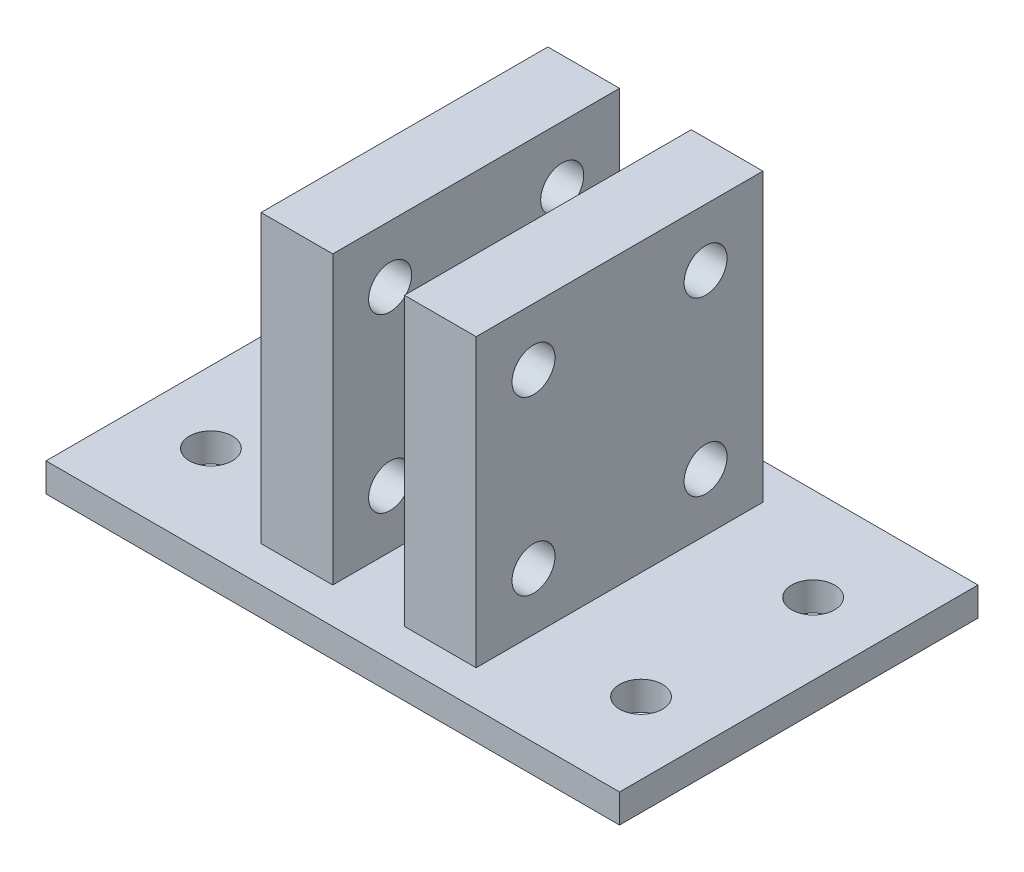
ISO-10303-21;
HEADER;
FILE_DESCRIPTION(('STEP AP214'),'2;1');
FILE_NAME('part.step','',(''),(''),'','','');
FILE_SCHEMA(('AUTOMOTIVE_DESIGN { 1 0 10303 214 1 1 1 1 }'));
ENDSEC;
DATA;
#1=APPLICATION_CONTEXT('core data for automotive mechanical design processes');
#2=APPLICATION_PROTOCOL_DEFINITION('international standard','automotive_design',2000,#1);
#3=PRODUCT_CONTEXT('',#1,'mechanical');
#4=PRODUCT('Part','Part','',(#3));
#5=PRODUCT_RELATED_PRODUCT_CATEGORY('part','',(#4));
#6=PRODUCT_DEFINITION_FORMATION('','',#4);
#7=PRODUCT_DEFINITION_CONTEXT('part definition',#1,'design');
#8=PRODUCT_DEFINITION('design','',#6,#7);
#9=PRODUCT_DEFINITION_SHAPE('','',#8);
#10=(LENGTH_UNIT() NAMED_UNIT(*) SI_UNIT(.MILLI.,.METRE.));
#11=(NAMED_UNIT(*) PLANE_ANGLE_UNIT() SI_UNIT($,.RADIAN.));
#12=(NAMED_UNIT(*) SI_UNIT($,.STERADIAN.) SOLID_ANGLE_UNIT());
#13=UNCERTAINTY_MEASURE_WITH_UNIT(LENGTH_MEASURE(1.E-05),#10,'distance_accuracy_value','');
#14=(GEOMETRIC_REPRESENTATION_CONTEXT(3) GLOBAL_UNCERTAINTY_ASSIGNED_CONTEXT((#13)) GLOBAL_UNIT_ASSIGNED_CONTEXT((#10,
#11,#12)) REPRESENTATION_CONTEXT('',''));
#15=CARTESIAN_POINT('',(0.,0.,0.));
#16=DIRECTION('',(0.,0.,1.));
#17=DIRECTION('',(1.,0.,0.));
#18=AXIS2_PLACEMENT_3D('',#15,#16,#17);
#19=CARTESIAN_POINT('',(-7.5,22.,-10.));
#20=DIRECTION('',(0.,0.,1.));
#21=DIRECTION('',(1.,0.,0.));
#22=AXIS2_PLACEMENT_3D('',#19,#20,#21);
#23=PLANE('',#22);
#24=DIRECTION('',(-1.,0.,0.));
#25=VECTOR('',#24,1.);
#26=CARTESIAN_POINT('',(-7.5,2.,-10.));
#27=LINE('',#26,#25);
#28=CARTESIAN_POINT('',(7.5,2.,-10.));
#29=VERTEX_POINT('',#28);
#30=CARTESIAN_POINT('',(2.5,2.,-10.));
#31=VERTEX_POINT('',#30);
#32=EDGE_CURVE('E143',#29,#31,#27,.T.);
#33=ORIENTED_EDGE('',*,*,#32,.T.);
#34=DIRECTION('',(0.,1.,0.));
#35=VECTOR('',#34,1.);
#36=CARTESIAN_POINT('',(2.5,2.,-10.));
#37=LINE('',#36,#35);
#38=CARTESIAN_POINT('',(2.5,22.,-10.));
#39=VERTEX_POINT('',#38);
#40=EDGE_CURVE('E129',#31,#39,#37,.T.);
#41=ORIENTED_EDGE('',*,*,#40,.T.);
#42=DIRECTION('',(-1.,0.,0.));
#43=VECTOR('',#42,1.);
#44=CARTESIAN_POINT('',(-7.5,22.,-10.));
#45=LINE('',#44,#43);
#46=CARTESIAN_POINT('',(7.5,22.,-10.));
#47=VERTEX_POINT('',#46);
#48=EDGE_CURVE('E278',#47,#39,#45,.T.);
#49=ORIENTED_EDGE('',*,*,#48,.F.);
#50=DIRECTION('',(0.,-1.,0.));
#51=VECTOR('',#50,1.);
#52=CARTESIAN_POINT('',(7.5,22.,-10.));
#53=LINE('',#52,#51);
#54=EDGE_CURVE('E148',#47,#29,#53,.T.);
#55=ORIENTED_EDGE('',*,*,#54,.T.);
#56=EDGE_LOOP('',(#33,#41,#49,#55));
#57=FACE_BOUND('',#56,.T.);
#58=ADVANCED_FACE('F37',(#57),#23,.F.);
#59=CARTESIAN_POINT('',(-7.5,22.,10.));
#60=DIRECTION('',(0.,0.,-1.));
#61=DIRECTION('',(-1.,0.,0.));
#62=AXIS2_PLACEMENT_3D('',#59,#60,#61);
#63=PLANE('',#62);
#64=DIRECTION('',(1.,0.,0.));
#65=VECTOR('',#64,1.);
#66=CARTESIAN_POINT('',(-7.5,22.,10.));
#67=LINE('',#66,#65);
#68=CARTESIAN_POINT('',(2.5,22.,10.));
#69=VERTEX_POINT('',#68);
#70=CARTESIAN_POINT('',(7.5,22.,10.));
#71=VERTEX_POINT('',#70);
#72=EDGE_CURVE('E281',#69,#71,#67,.T.);
#73=ORIENTED_EDGE('',*,*,#72,.F.);
#74=DIRECTION('',(0.,1.,0.));
#75=VECTOR('',#74,1.);
#76=CARTESIAN_POINT('',(2.5,2.,10.));
#77=LINE('',#76,#75);
#78=CARTESIAN_POINT('',(2.5,2.,10.));
#79=VERTEX_POINT('',#78);
#80=EDGE_CURVE('E269',#79,#69,#77,.T.);
#81=ORIENTED_EDGE('',*,*,#80,.F.);
#82=DIRECTION('',(1.,0.,0.));
#83=VECTOR('',#82,1.);
#84=CARTESIAN_POINT('',(-7.5,2.,10.));
#85=LINE('',#84,#83);
#86=CARTESIAN_POINT('',(7.5,2.,10.));
#87=VERTEX_POINT('',#86);
#88=EDGE_CURVE('E62',#79,#87,#85,.T.);
#89=ORIENTED_EDGE('',*,*,#88,.T.);
#90=DIRECTION('',(0.,-1.,0.));
#91=VECTOR('',#90,1.);
#92=CARTESIAN_POINT('',(7.5,22.,10.));
#93=LINE('',#92,#91);
#94=EDGE_CURVE('E163',#71,#87,#93,.T.);
#95=ORIENTED_EDGE('',*,*,#94,.F.);
#96=EDGE_LOOP('',(#73,#81,#89,#95));
#97=FACE_BOUND('',#96,.T.);
#98=ADVANCED_FACE('F289',(#97),#63,.F.);
#99=CARTESIAN_POINT('',(0.,22.,0.));
#100=DIRECTION('',(0.,1.,0.));
#101=DIRECTION('',(0.,0.,1.));
#102=AXIS2_PLACEMENT_3D('',#99,#100,#101);
#103=PLANE('',#102);
#104=DIRECTION('',(0.,0.,-1.));
#105=VECTOR('',#104,1.);
#106=CARTESIAN_POINT('',(2.5,22.,-10.));
#107=LINE('',#106,#105);
#108=EDGE_CURVE('E134',#69,#39,#107,.T.);
#109=ORIENTED_EDGE('',*,*,#108,.F.);
#110=ORIENTED_EDGE('',*,*,#72,.T.);
#111=DIRECTION('',(0.,0.,-1.));
#112=VECTOR('',#111,1.);
#113=CARTESIAN_POINT('',(7.5,22.,-10.));
#114=LINE('',#113,#112);
#115=EDGE_CURVE('E162',#71,#47,#114,.T.);
#116=ORIENTED_EDGE('',*,*,#115,.T.);
#117=ORIENTED_EDGE('',*,*,#48,.T.);
#118=EDGE_LOOP('',(#109,#110,#116,#117));
#119=FACE_BOUND('',#118,.T.);
#120=ADVANCED_FACE('F287',(#119),#103,.T.);
#121=CARTESIAN_POINT('',(20.,2.,-12.5));
#122=DIRECTION('',(-1.,0.,0.));
#123=DIRECTION('',(0.,0.,1.));
#124=AXIS2_PLACEMENT_3D('',#121,#122,#123);
#125=PLANE('',#124);
#126=DIRECTION('',(0.,0.,-1.));
#127=VECTOR('',#126,1.);
#128=CARTESIAN_POINT('',(20.,0.,-12.5));
#129=LINE('',#128,#127);
#130=CARTESIAN_POINT('',(20.,0.,12.5));
#131=VERTEX_POINT('',#130);
#132=CARTESIAN_POINT('',(20.,0.,-12.5));
#133=VERTEX_POINT('',#132);
#134=EDGE_CURVE('E174',#131,#133,#129,.T.);
#135=ORIENTED_EDGE('',*,*,#134,.T.);
#136=DIRECTION('',(0.,-1.,0.));
#137=VECTOR('',#136,1.);
#138=CARTESIAN_POINT('',(20.,2.,-12.5));
#139=LINE('',#138,#137);
#140=CARTESIAN_POINT('',(20.,2.,-12.5));
#141=VERTEX_POINT('',#140);
#142=EDGE_CURVE('E11',#141,#133,#139,.T.);
#143=ORIENTED_EDGE('',*,*,#142,.F.);
#144=DIRECTION('',(0.,0.,-1.));
#145=VECTOR('',#144,1.);
#146=CARTESIAN_POINT('',(20.,2.,-12.5));
#147=LINE('',#146,#145);
#148=CARTESIAN_POINT('',(20.,2.,12.5));
#149=VERTEX_POINT('',#148);
#150=EDGE_CURVE('E175',#149,#141,#147,.T.);
#151=ORIENTED_EDGE('',*,*,#150,.F.);
#152=DIRECTION('',(0.,-1.,0.));
#153=VECTOR('',#152,1.);
#154=CARTESIAN_POINT('',(20.,2.,12.5));
#155=LINE('',#154,#153);
#156=EDGE_CURVE('E185',#149,#131,#155,.T.);
#157=ORIENTED_EDGE('',*,*,#156,.T.);
#158=EDGE_LOOP('',(#135,#143,#151,#157));
#159=FACE_BOUND('',#158,.T.);
#160=ADVANCED_FACE('F39',(#159),#125,.F.);
#161=CARTESIAN_POINT('',(-20.,2.,-12.5));
#162=DIRECTION('',(0.,0.,1.));
#163=DIRECTION('',(1.,0.,0.));
#164=AXIS2_PLACEMENT_3D('',#161,#162,#163);
#165=PLANE('',#164);
#166=DIRECTION('',(-1.,0.,0.));
#167=VECTOR('',#166,1.);
#168=CARTESIAN_POINT('',(-20.,0.,-12.5));
#169=LINE('',#168,#167);
#170=CARTESIAN_POINT('',(-20.,0.,-12.5));
#171=VERTEX_POINT('',#170);
#172=EDGE_CURVE('E188',#133,#171,#169,.T.);
#173=ORIENTED_EDGE('',*,*,#172,.T.);
#174=DIRECTION('',(0.,-1.,0.));
#175=VECTOR('',#174,1.);
#176=CARTESIAN_POINT('',(-20.,2.,-12.5));
#177=LINE('',#176,#175);
#178=CARTESIAN_POINT('',(-20.,2.,-12.5));
#179=VERTEX_POINT('',#178);
#180=EDGE_CURVE('E46',#179,#171,#177,.T.);
#181=ORIENTED_EDGE('',*,*,#180,.F.);
#182=DIRECTION('',(-1.,0.,0.));
#183=VECTOR('',#182,1.);
#184=CARTESIAN_POINT('',(-20.,2.,-12.5));
#185=LINE('',#184,#183);
#186=EDGE_CURVE('E178',#141,#179,#185,.T.);
#187=ORIENTED_EDGE('',*,*,#186,.F.);
#188=ORIENTED_EDGE('',*,*,#142,.T.);
#189=EDGE_LOOP('',(#173,#181,#187,#188));
#190=FACE_BOUND('',#189,.T.);
#191=ADVANCED_FACE('F391',(#190),#165,.F.);
#192=CARTESIAN_POINT('',(-20.,2.,-12.5));
#193=DIRECTION('',(1.,0.,0.));
#194=DIRECTION('',(0.,0.,-1.));
#195=AXIS2_PLACEMENT_3D('',#192,#193,#194);
#196=PLANE('',#195);
#197=DIRECTION('',(0.,0.,1.));
#198=VECTOR('',#197,1.);
#199=CARTESIAN_POINT('',(-20.,0.,-12.5));
#200=LINE('',#199,#198);
#201=CARTESIAN_POINT('',(-20.,0.,12.5));
#202=VERTEX_POINT('',#201);
#203=EDGE_CURVE('E190',#171,#202,#200,.T.);
#204=ORIENTED_EDGE('',*,*,#203,.T.);
#205=DIRECTION('',(0.,-1.,0.));
#206=VECTOR('',#205,1.);
#207=CARTESIAN_POINT('',(-20.,2.,12.5));
#208=LINE('',#207,#206);
#209=CARTESIAN_POINT('',(-20.,2.,12.5));
#210=VERTEX_POINT('',#209);
#211=EDGE_CURVE('E195',#210,#202,#208,.T.);
#212=ORIENTED_EDGE('',*,*,#211,.F.);
#213=DIRECTION('',(0.,0.,1.));
#214=VECTOR('',#213,1.);
#215=CARTESIAN_POINT('',(-20.,2.,-12.5));
#216=LINE('',#215,#214);
#217=EDGE_CURVE('E181',#179,#210,#216,.T.);
#218=ORIENTED_EDGE('',*,*,#217,.F.);
#219=ORIENTED_EDGE('',*,*,#180,.T.);
#220=EDGE_LOOP('',(#204,#212,#218,#219));
#221=FACE_BOUND('',#220,.T.);
#222=ADVANCED_FACE('F388',(#221),#196,.F.);
#223=CARTESIAN_POINT('',(-20.,2.,12.5));
#224=DIRECTION('',(0.,0.,-1.));
#225=DIRECTION('',(-1.,0.,0.));
#226=AXIS2_PLACEMENT_3D('',#223,#224,#225);
#227=PLANE('',#226);
#228=DIRECTION('',(1.,0.,0.));
#229=VECTOR('',#228,1.);
#230=CARTESIAN_POINT('',(-20.,0.,12.5));
#231=LINE('',#230,#229);
#232=EDGE_CURVE('E179',#202,#131,#231,.T.);
#233=ORIENTED_EDGE('',*,*,#232,.T.);
#234=ORIENTED_EDGE('',*,*,#156,.F.);
#235=DIRECTION('',(1.,0.,0.));
#236=VECTOR('',#235,1.);
#237=CARTESIAN_POINT('',(-20.,2.,12.5));
#238=LINE('',#237,#236);
#239=EDGE_CURVE('E183',#210,#149,#238,.T.);
#240=ORIENTED_EDGE('',*,*,#239,.F.);
#241=ORIENTED_EDGE('',*,*,#211,.T.);
#242=EDGE_LOOP('',(#233,#234,#240,#241));
#243=FACE_BOUND('',#242,.T.);
#244=ADVANCED_FACE('F384',(#243),#227,.F.);
#245=CARTESIAN_POINT('',(0.,2.,0.));
#246=DIRECTION('',(0.,1.,0.));
#247=DIRECTION('',(0.,0.,1.));
#248=AXIS2_PLACEMENT_3D('',#245,#246,#247);
#249=PLANE('',#248);
#250=CARTESIAN_POINT('',(-15.,2.,6.));
#251=DIRECTION('',(0.,1.,0.));
#252=DIRECTION('',(0.,0.,1.));
#253=AXIS2_PLACEMENT_3D('',#250,#251,#252);
#254=CIRCLE('',#253,1.5);
#255=CARTESIAN_POINT('',(-15.,2.,7.5));
#256=VERTEX_POINT('',#255);
#257=EDGE_CURVE('E603',#256,#256,#254,.T.);
#258=ORIENTED_EDGE('',*,*,#257,.F.);
#259=EDGE_LOOP('',(#258));
#260=FACE_BOUND('',#259,.T.);
#261=CARTESIAN_POINT('',(15.,2.,-6.));
#262=DIRECTION('',(0.,1.,0.));
#263=DIRECTION('',(0.,0.,1.));
#264=AXIS2_PLACEMENT_3D('',#261,#262,#263);
#265=CIRCLE('',#264,1.5);
#266=CARTESIAN_POINT('',(15.,2.,-4.5));
#267=VERTEX_POINT('',#266);
#268=EDGE_CURVE('E607',#267,#267,#265,.T.);
#269=ORIENTED_EDGE('',*,*,#268,.F.);
#270=EDGE_LOOP('',(#269));
#271=FACE_BOUND('',#270,.T.);
#272=CARTESIAN_POINT('',(15.,2.,6.));
#273=DIRECTION('',(0.,1.,0.));
#274=DIRECTION('',(0.,0.,1.));
#275=AXIS2_PLACEMENT_3D('',#272,#273,#274);
#276=CIRCLE('',#275,1.5);
#277=CARTESIAN_POINT('',(15.,2.,7.5));
#278=VERTEX_POINT('',#277);
#279=EDGE_CURVE('E369',#278,#278,#276,.T.);
#280=ORIENTED_EDGE('',*,*,#279,.F.);
#281=EDGE_LOOP('',(#280));
#282=FACE_BOUND('',#281,.T.);
#283=CARTESIAN_POINT('',(-15.,2.,-6.));
#284=DIRECTION('',(0.,1.,0.));
#285=DIRECTION('',(0.,0.,1.));
#286=AXIS2_PLACEMENT_3D('',#283,#284,#285);
#287=CIRCLE('',#286,1.5);
#288=CARTESIAN_POINT('',(-15.,2.,-4.5));
#289=VERTEX_POINT('',#288);
#290=EDGE_CURVE('E221',#289,#289,#287,.T.);
#291=ORIENTED_EDGE('',*,*,#290,.F.);
#292=EDGE_LOOP('',(#291));
#293=FACE_BOUND('',#292,.T.);
#294=CARTESIAN_POINT('',(-2.5,2.,-10.));
#295=VERTEX_POINT('',#294);
#296=CARTESIAN_POINT('',(-7.5,2.,-10.));
#297=VERTEX_POINT('',#296);
#298=EDGE_CURVE('E151',#295,#297,#27,.T.);
#299=ORIENTED_EDGE('',*,*,#298,.F.);
#300=DIRECTION('',(0.,0.,1.));
#301=VECTOR('',#300,1.);
#302=CARTESIAN_POINT('',(-2.5,2.,-10.));
#303=LINE('',#302,#301);
#304=CARTESIAN_POINT('',(-2.5,2.,10.));
#305=VERTEX_POINT('',#304);
#306=EDGE_CURVE('E138',#295,#305,#303,.T.);
#307=ORIENTED_EDGE('',*,*,#306,.T.);
#308=CARTESIAN_POINT('',(-7.5,2.,10.));
#309=VERTEX_POINT('',#308);
#310=EDGE_CURVE('E159',#309,#305,#85,.T.);
#311=ORIENTED_EDGE('',*,*,#310,.F.);
#312=DIRECTION('',(0.,0.,1.));
#313=VECTOR('',#312,1.);
#314=CARTESIAN_POINT('',(-7.5,2.,-10.));
#315=LINE('',#314,#313);
#316=EDGE_CURVE('E150',#297,#309,#315,.T.);
#317=ORIENTED_EDGE('',*,*,#316,.F.);
#318=EDGE_LOOP('',(#299,#307,#311,#317));
#319=FACE_BOUND('',#318,.T.);
#320=DIRECTION('',(0.,0.,-1.));
#321=VECTOR('',#320,1.);
#322=CARTESIAN_POINT('',(7.5,2.,-10.));
#323=LINE('',#322,#321);
#324=EDGE_CURVE('E155',#87,#29,#323,.T.);
#325=ORIENTED_EDGE('',*,*,#324,.F.);
#326=ORIENTED_EDGE('',*,*,#88,.F.);
#327=DIRECTION('',(0.,0.,-1.));
#328=VECTOR('',#327,1.);
#329=CARTESIAN_POINT('',(2.5,2.,-10.));
#330=LINE('',#329,#328);
#331=EDGE_CURVE('E132',#79,#31,#330,.T.);
#332=ORIENTED_EDGE('',*,*,#331,.T.);
#333=ORIENTED_EDGE('',*,*,#32,.F.);
#334=EDGE_LOOP('',(#325,#326,#332,#333));
#335=FACE_BOUND('',#334,.T.);
#336=ORIENTED_EDGE('',*,*,#150,.T.);
#337=ORIENTED_EDGE('',*,*,#186,.T.);
#338=ORIENTED_EDGE('',*,*,#217,.T.);
#339=ORIENTED_EDGE('',*,*,#239,.T.);
#340=EDGE_LOOP('',(#336,#337,#338,#339));
#341=FACE_BOUND('',#340,.T.);
#342=ADVANCED_FACE('F141',(#260,#271,#282,#293,#319,#335,#341),#249,.T.);
#343=CARTESIAN_POINT('',(0.,0.,0.));
#344=DIRECTION('',(0.,1.,0.));
#345=DIRECTION('',(0.,0.,1.));
#346=AXIS2_PLACEMENT_3D('',#343,#344,#345);
#347=PLANE('',#346);
#348=CARTESIAN_POINT('',(-15.,0.,6.));
#349=DIRECTION('',(0.,1.,0.));
#350=DIRECTION('',(0.,0.,1.));
#351=AXIS2_PLACEMENT_3D('',#348,#349,#350);
#352=CIRCLE('',#351,1.5);
#353=CARTESIAN_POINT('',(-15.,0.,7.5));
#354=VERTEX_POINT('',#353);
#355=EDGE_CURVE('E41',#354,#354,#352,.T.);
#356=ORIENTED_EDGE('',*,*,#355,.T.);
#357=EDGE_LOOP('',(#356));
#358=FACE_BOUND('',#357,.T.);
#359=CARTESIAN_POINT('',(15.,0.,-6.));
#360=DIRECTION('',(0.,1.,0.));
#361=DIRECTION('',(0.,0.,1.));
#362=AXIS2_PLACEMENT_3D('',#359,#360,#361);
#363=CIRCLE('',#362,1.5);
#364=CARTESIAN_POINT('',(15.,0.,-4.5));
#365=VERTEX_POINT('',#364);
#366=EDGE_CURVE('E223',#365,#365,#363,.T.);
#367=ORIENTED_EDGE('',*,*,#366,.T.);
#368=EDGE_LOOP('',(#367));
#369=FACE_BOUND('',#368,.T.);
#370=CARTESIAN_POINT('',(15.,0.,6.));
#371=DIRECTION('',(0.,1.,0.));
#372=DIRECTION('',(0.,0.,1.));
#373=AXIS2_PLACEMENT_3D('',#370,#371,#372);
#374=CIRCLE('',#373,1.5);
#375=CARTESIAN_POINT('',(15.,0.,7.5));
#376=VERTEX_POINT('',#375);
#377=EDGE_CURVE('E220',#376,#376,#374,.T.);
#378=ORIENTED_EDGE('',*,*,#377,.T.);
#379=EDGE_LOOP('',(#378));
#380=FACE_BOUND('',#379,.T.);
#381=CARTESIAN_POINT('',(-15.,0.,-6.));
#382=DIRECTION('',(0.,1.,0.));
#383=DIRECTION('',(0.,0.,1.));
#384=AXIS2_PLACEMENT_3D('',#381,#382,#383);
#385=CIRCLE('',#384,1.5);
#386=CARTESIAN_POINT('',(-15.,0.,-4.5));
#387=VERTEX_POINT('',#386);
#388=EDGE_CURVE('E217',#387,#387,#385,.T.);
#389=ORIENTED_EDGE('',*,*,#388,.T.);
#390=EDGE_LOOP('',(#389));
#391=FACE_BOUND('',#390,.T.);
#392=ORIENTED_EDGE('',*,*,#134,.F.);
#393=ORIENTED_EDGE('',*,*,#232,.F.);
#394=ORIENTED_EDGE('',*,*,#203,.F.);
#395=ORIENTED_EDGE('',*,*,#172,.F.);
#396=EDGE_LOOP('',(#392,#393,#394,#395));
#397=FACE_BOUND('',#396,.T.);
#398=ADVANCED_FACE('F294',(#358,#369,#380,#391,#397),#347,.F.);
#399=CARTESIAN_POINT('',(7.5,22.,-10.));
#400=DIRECTION('',(-1.,0.,0.));
#401=DIRECTION('',(0.,0.,1.));
#402=AXIS2_PLACEMENT_3D('',#399,#400,#401);
#403=PLANE('',#402);
#404=CARTESIAN_POINT('',(7.5,18.,-6.));
#405=DIRECTION('',(1.,0.,0.));
#406=DIRECTION('',(0.,0.,-1.));
#407=AXIS2_PLACEMENT_3D('',#404,#405,#406);
#408=CIRCLE('',#407,1.5);
#409=CARTESIAN_POINT('',(7.5,18.,-7.5));
#410=VERTEX_POINT('',#409);
#411=EDGE_CURVE('E245',#410,#410,#408,.T.);
#412=ORIENTED_EDGE('',*,*,#411,.F.);
#413=EDGE_LOOP('',(#412));
#414=FACE_BOUND('',#413,.T.);
#415=CARTESIAN_POINT('',(7.5,5.99999999999999,6.));
#416=DIRECTION('',(1.,0.,0.));
#417=DIRECTION('',(0.,0.,-1.));
#418=AXIS2_PLACEMENT_3D('',#415,#416,#417);
#419=CIRCLE('',#418,1.5);
#420=CARTESIAN_POINT('',(7.5,5.99999999999999,4.5));
#421=VERTEX_POINT('',#420);
#422=EDGE_CURVE('E237',#421,#421,#419,.T.);
#423=ORIENTED_EDGE('',*,*,#422,.F.);
#424=EDGE_LOOP('',(#423));
#425=FACE_BOUND('',#424,.T.);
#426=CARTESIAN_POINT('',(7.5,5.99999999999999,-6.));
#427=DIRECTION('',(1.,0.,0.));
#428=DIRECTION('',(0.,0.,-1.));
#429=AXIS2_PLACEMENT_3D('',#426,#427,#428);
#430=CIRCLE('',#429,1.5);
#431=CARTESIAN_POINT('',(7.5,5.99999999999999,-7.5));
#432=VERTEX_POINT('',#431);
#433=EDGE_CURVE('E228',#432,#432,#430,.T.);
#434=ORIENTED_EDGE('',*,*,#433,.F.);
#435=EDGE_LOOP('',(#434));
#436=FACE_BOUND('',#435,.T.);
#437=CARTESIAN_POINT('',(7.5,18.,6.00000000000001));
#438=DIRECTION('',(1.,0.,0.));
#439=DIRECTION('',(0.,0.,-1.));
#440=AXIS2_PLACEMENT_3D('',#437,#438,#439);
#441=CIRCLE('',#440,1.5);
#442=CARTESIAN_POINT('',(7.5,18.,4.5));
#443=VERTEX_POINT('',#442);
#444=EDGE_CURVE('E244',#443,#443,#441,.T.);
#445=ORIENTED_EDGE('',*,*,#444,.F.);
#446=EDGE_LOOP('',(#445));
#447=FACE_BOUND('',#446,.T.);
#448=ORIENTED_EDGE('',*,*,#324,.T.);
#449=ORIENTED_EDGE('',*,*,#54,.F.);
#450=ORIENTED_EDGE('',*,*,#115,.F.);
#451=ORIENTED_EDGE('',*,*,#94,.T.);
#452=EDGE_LOOP('',(#448,#449,#450,#451));
#453=FACE_BOUND('',#452,.T.);
#454=ADVANCED_FACE('F291',(#414,#425,#436,#447,#453),#403,.F.);
#455=CARTESIAN_POINT('',(-2.5,22.,-10.));
#456=VERTEX_POINT('',#455);
#457=CARTESIAN_POINT('',(-7.5,22.,-10.));
#458=VERTEX_POINT('',#457);
#459=EDGE_CURVE('E277',#456,#458,#45,.T.);
#460=ORIENTED_EDGE('',*,*,#459,.F.);
#461=DIRECTION('',(0.,1.,0.));
#462=VECTOR('',#461,1.);
#463=CARTESIAN_POINT('',(-2.5,2.,-10.));
#464=LINE('',#463,#462);
#465=EDGE_CURVE('E54',#295,#456,#464,.T.);
#466=ORIENTED_EDGE('',*,*,#465,.F.);
#467=ORIENTED_EDGE('',*,*,#298,.T.);
#468=DIRECTION('',(0.,-1.,0.));
#469=VECTOR('',#468,1.);
#470=CARTESIAN_POINT('',(-7.5,22.,-10.));
#471=LINE('',#470,#469);
#472=EDGE_CURVE('E170',#458,#297,#471,.T.);
#473=ORIENTED_EDGE('',*,*,#472,.F.);
#474=EDGE_LOOP('',(#460,#466,#467,#473));
#475=FACE_BOUND('',#474,.T.);
#476=ADVANCED_FACE('F293',(#475),#23,.F.);
#477=CARTESIAN_POINT('',(-7.5,22.,-10.));
#478=DIRECTION('',(1.,0.,0.));
#479=DIRECTION('',(0.,0.,-1.));
#480=AXIS2_PLACEMENT_3D('',#477,#478,#479);
#481=PLANE('',#480);
#482=CARTESIAN_POINT('',(-7.5,18.,-6.));
#483=DIRECTION('',(1.,0.,0.));
#484=DIRECTION('',(0.,0.,-1.));
#485=AXIS2_PLACEMENT_3D('',#482,#483,#484);
#486=CIRCLE('',#485,1.5);
#487=CARTESIAN_POINT('',(-7.5,18.,-7.5));
#488=VERTEX_POINT('',#487);
#489=EDGE_CURVE('E241',#488,#488,#486,.T.);
#490=ORIENTED_EDGE('',*,*,#489,.T.);
#491=EDGE_LOOP('',(#490));
#492=FACE_BOUND('',#491,.T.);
#493=CARTESIAN_POINT('',(-7.5,5.99999999999999,6.00000000000001));
#494=DIRECTION('',(1.,0.,0.));
#495=DIRECTION('',(0.,0.,-1.));
#496=AXIS2_PLACEMENT_3D('',#493,#494,#495);
#497=CIRCLE('',#496,1.5);
#498=CARTESIAN_POINT('',(-7.5,5.99999999999999,4.50000000000001));
#499=VERTEX_POINT('',#498);
#500=EDGE_CURVE('E248',#499,#499,#497,.T.);
#501=ORIENTED_EDGE('',*,*,#500,.T.);
#502=EDGE_LOOP('',(#501));
#503=FACE_BOUND('',#502,.T.);
#504=CARTESIAN_POINT('',(-7.5,5.99999999999999,-6.));
#505=DIRECTION('',(1.,0.,0.));
#506=DIRECTION('',(0.,0.,-1.));
#507=AXIS2_PLACEMENT_3D('',#504,#505,#506);
#508=CIRCLE('',#507,1.5);
#509=CARTESIAN_POINT('',(-7.5,5.99999999999999,-7.5));
#510=VERTEX_POINT('',#509);
#511=EDGE_CURVE('E232',#510,#510,#508,.T.);
#512=ORIENTED_EDGE('',*,*,#511,.T.);
#513=EDGE_LOOP('',(#512));
#514=FACE_BOUND('',#513,.T.);
#515=CARTESIAN_POINT('',(-7.5,18.,6.00000000000001));
#516=DIRECTION('',(1.,0.,0.));
#517=DIRECTION('',(0.,0.,-1.));
#518=AXIS2_PLACEMENT_3D('',#515,#516,#517);
#519=CIRCLE('',#518,1.5);
#520=CARTESIAN_POINT('',(-7.5,18.,4.50000000000001));
#521=VERTEX_POINT('',#520);
#522=EDGE_CURVE('E204',#521,#521,#519,.T.);
#523=ORIENTED_EDGE('',*,*,#522,.T.);
#524=EDGE_LOOP('',(#523));
#525=FACE_BOUND('',#524,.T.);
#526=ORIENTED_EDGE('',*,*,#316,.T.);
#527=DIRECTION('',(0.,-1.,0.));
#528=VECTOR('',#527,1.);
#529=CARTESIAN_POINT('',(-7.5,22.,10.));
#530=LINE('',#529,#528);
#531=CARTESIAN_POINT('',(-7.5,22.,10.));
#532=VERTEX_POINT('',#531);
#533=EDGE_CURVE('E166',#532,#309,#530,.T.);
#534=ORIENTED_EDGE('',*,*,#533,.F.);
#535=DIRECTION('',(0.,0.,1.));
#536=VECTOR('',#535,1.);
#537=CARTESIAN_POINT('',(-7.5,22.,-10.));
#538=LINE('',#537,#536);
#539=EDGE_CURVE('E280',#458,#532,#538,.T.);
#540=ORIENTED_EDGE('',*,*,#539,.F.);
#541=ORIENTED_EDGE('',*,*,#472,.T.);
#542=EDGE_LOOP('',(#526,#534,#540,#541));
#543=FACE_BOUND('',#542,.T.);
#544=ADVANCED_FACE('F301',(#492,#503,#514,#525,#543),#481,.F.);
#545=ORIENTED_EDGE('',*,*,#310,.T.);
#546=DIRECTION('',(0.,1.,0.));
#547=VECTOR('',#546,1.);
#548=CARTESIAN_POINT('',(-2.5,2.,10.));
#549=LINE('',#548,#547);
#550=CARTESIAN_POINT('',(-2.5,22.,10.));
#551=VERTEX_POINT('',#550);
#552=EDGE_CURVE('E271',#305,#551,#549,.T.);
#553=ORIENTED_EDGE('',*,*,#552,.T.);
#554=EDGE_CURVE('E167',#532,#551,#67,.T.);
#555=ORIENTED_EDGE('',*,*,#554,.F.);
#556=ORIENTED_EDGE('',*,*,#533,.T.);
#557=EDGE_LOOP('',(#545,#553,#555,#556));
#558=FACE_BOUND('',#557,.T.);
#559=ADVANCED_FACE('F313',(#558),#63,.F.);
#560=DIRECTION('',(0.,0.,1.));
#561=VECTOR('',#560,1.);
#562=CARTESIAN_POINT('',(-2.5,22.,-10.));
#563=LINE('',#562,#561);
#564=EDGE_CURVE('E145',#456,#551,#563,.T.);
#565=ORIENTED_EDGE('',*,*,#564,.F.);
#566=ORIENTED_EDGE('',*,*,#459,.T.);
#567=ORIENTED_EDGE('',*,*,#539,.T.);
#568=ORIENTED_EDGE('',*,*,#554,.T.);
#569=EDGE_LOOP('',(#565,#566,#567,#568));
#570=FACE_BOUND('',#569,.T.);
#571=ADVANCED_FACE('F319',(#570),#103,.T.);
#572=CARTESIAN_POINT('',(2.5,2.,-10.));
#573=DIRECTION('',(1.,0.,0.));
#574=DIRECTION('',(0.,0.,-1.));
#575=AXIS2_PLACEMENT_3D('',#572,#573,#574);
#576=PLANE('',#575);
#577=CARTESIAN_POINT('',(2.5,18.,-6.));
#578=DIRECTION('',(1.,0.,0.));
#579=DIRECTION('',(0.,0.,-1.));
#580=AXIS2_PLACEMENT_3D('',#577,#578,#579);
#581=CIRCLE('',#580,1.5);
#582=CARTESIAN_POINT('',(2.5,18.,-7.5));
#583=VERTEX_POINT('',#582);
#584=EDGE_CURVE('E216',#583,#583,#581,.T.);
#585=ORIENTED_EDGE('',*,*,#584,.T.);
#586=EDGE_LOOP('',(#585));
#587=FACE_BOUND('',#586,.T.);
#588=CARTESIAN_POINT('',(2.5,5.99999999999999,6.));
#589=DIRECTION('',(1.,0.,0.));
#590=DIRECTION('',(0.,0.,-1.));
#591=AXIS2_PLACEMENT_3D('',#588,#589,#590);
#592=CIRCLE('',#591,1.5);
#593=CARTESIAN_POINT('',(2.5,5.99999999999999,4.5));
#594=VERTEX_POINT('',#593);
#595=EDGE_CURVE('E212',#594,#594,#592,.T.);
#596=ORIENTED_EDGE('',*,*,#595,.T.);
#597=EDGE_LOOP('',(#596));
#598=FACE_BOUND('',#597,.T.);
#599=CARTESIAN_POINT('',(2.5,5.99999999999999,-6.));
#600=DIRECTION('',(1.,0.,0.));
#601=DIRECTION('',(0.,0.,-1.));
#602=AXIS2_PLACEMENT_3D('',#599,#600,#601);
#603=CIRCLE('',#602,1.5);
#604=CARTESIAN_POINT('',(2.5,5.99999999999999,-7.5));
#605=VERTEX_POINT('',#604);
#606=EDGE_CURVE('E208',#605,#605,#603,.T.);
#607=ORIENTED_EDGE('',*,*,#606,.T.);
#608=EDGE_LOOP('',(#607));
#609=FACE_BOUND('',#608,.T.);
#610=CARTESIAN_POINT('',(2.5,18.,6.00000000000001));
#611=DIRECTION('',(1.,0.,0.));
#612=DIRECTION('',(0.,0.,-1.));
#613=AXIS2_PLACEMENT_3D('',#610,#611,#612);
#614=CIRCLE('',#613,1.5);
#615=CARTESIAN_POINT('',(2.5,18.,4.5));
#616=VERTEX_POINT('',#615);
#617=EDGE_CURVE('E203',#616,#616,#614,.T.);
#618=ORIENTED_EDGE('',*,*,#617,.T.);
#619=EDGE_LOOP('',(#618));
#620=FACE_BOUND('',#619,.T.);
#621=ORIENTED_EDGE('',*,*,#108,.T.);
#622=ORIENTED_EDGE('',*,*,#40,.F.);
#623=ORIENTED_EDGE('',*,*,#331,.F.);
#624=ORIENTED_EDGE('',*,*,#80,.T.);
#625=EDGE_LOOP('',(#621,#622,#623,#624));
#626=FACE_BOUND('',#625,.T.);
#627=ADVANCED_FACE('F131',(#587,#598,#609,#620,#626),#576,.F.);
#628=CARTESIAN_POINT('',(-2.5,2.,-10.));
#629=DIRECTION('',(-1.,0.,0.));
#630=DIRECTION('',(0.,0.,1.));
#631=AXIS2_PLACEMENT_3D('',#628,#629,#630);
#632=PLANE('',#631);
#633=CARTESIAN_POINT('',(-2.5,18.,-6.));
#634=DIRECTION('',(-1.,0.,0.));
#635=DIRECTION('',(0.,0.,1.));
#636=AXIS2_PLACEMENT_3D('',#633,#634,#635);
#637=CIRCLE('',#636,1.5);
#638=CARTESIAN_POINT('',(-2.5,18.,-4.5));
#639=VERTEX_POINT('',#638);
#640=EDGE_CURVE('E213',#639,#639,#637,.T.);
#641=ORIENTED_EDGE('',*,*,#640,.T.);
#642=EDGE_LOOP('',(#641));
#643=FACE_BOUND('',#642,.T.);
#644=CARTESIAN_POINT('',(-2.5,5.99999999999999,6.));
#645=DIRECTION('',(-1.,0.,0.));
#646=DIRECTION('',(0.,0.,1.));
#647=AXIS2_PLACEMENT_3D('',#644,#645,#646);
#648=CIRCLE('',#647,1.5);
#649=CARTESIAN_POINT('',(-2.5,5.99999999999999,7.5));
#650=VERTEX_POINT('',#649);
#651=EDGE_CURVE('E209',#650,#650,#648,.T.);
#652=ORIENTED_EDGE('',*,*,#651,.T.);
#653=EDGE_LOOP('',(#652));
#654=FACE_BOUND('',#653,.T.);
#655=CARTESIAN_POINT('',(-2.5,5.99999999999999,-6.));
#656=DIRECTION('',(-1.,0.,0.));
#657=DIRECTION('',(0.,0.,1.));
#658=AXIS2_PLACEMENT_3D('',#655,#656,#657);
#659=CIRCLE('',#658,1.5);
#660=CARTESIAN_POINT('',(-2.5,5.99999999999999,-4.5));
#661=VERTEX_POINT('',#660);
#662=EDGE_CURVE('E205',#661,#661,#659,.T.);
#663=ORIENTED_EDGE('',*,*,#662,.T.);
#664=EDGE_LOOP('',(#663));
#665=FACE_BOUND('',#664,.T.);
#666=CARTESIAN_POINT('',(-2.5,18.,6.00000000000001));
#667=DIRECTION('',(-1.,0.,0.));
#668=DIRECTION('',(0.,0.,1.));
#669=AXIS2_PLACEMENT_3D('',#666,#667,#668);
#670=CIRCLE('',#669,1.5);
#671=CARTESIAN_POINT('',(-2.5,18.,7.50000000000001));
#672=VERTEX_POINT('',#671);
#673=EDGE_CURVE('E200',#672,#672,#670,.T.);
#674=ORIENTED_EDGE('',*,*,#673,.T.);
#675=EDGE_LOOP('',(#674));
#676=FACE_BOUND('',#675,.T.);
#677=ORIENTED_EDGE('',*,*,#564,.T.);
#678=ORIENTED_EDGE('',*,*,#552,.F.);
#679=ORIENTED_EDGE('',*,*,#306,.F.);
#680=ORIENTED_EDGE('',*,*,#465,.T.);
#681=EDGE_LOOP('',(#677,#678,#679,#680));
#682=FACE_BOUND('',#681,.T.);
#683=ADVANCED_FACE('F325',(#643,#654,#665,#676,#682),#632,.F.);
#684=CARTESIAN_POINT('',(-7.5,18.,6.00000000000001));
#685=DIRECTION('',(1.,0.,0.));
#686=DIRECTION('',(0.,0.,-1.));
#687=AXIS2_PLACEMENT_3D('',#684,#685,#686);
#688=CYLINDRICAL_SURFACE('',#687,1.5);
#689=ORIENTED_EDGE('',*,*,#522,.F.);
#690=EDGE_LOOP('',(#689));
#691=FACE_BOUND('',#690,.T.);
#692=ORIENTED_EDGE('',*,*,#673,.F.);
#693=EDGE_LOOP('',(#692));
#694=FACE_BOUND('',#693,.T.);
#695=ADVANCED_FACE('F329',(#691,#694),#688,.F.);
#696=CARTESIAN_POINT('',(-7.5,5.99999999999999,-6.));
#697=DIRECTION('',(1.,0.,0.));
#698=DIRECTION('',(0.,0.,-1.));
#699=AXIS2_PLACEMENT_3D('',#696,#697,#698);
#700=CYLINDRICAL_SURFACE('',#699,1.5);
#701=ORIENTED_EDGE('',*,*,#511,.F.);
#702=EDGE_LOOP('',(#701));
#703=FACE_BOUND('',#702,.T.);
#704=ORIENTED_EDGE('',*,*,#662,.F.);
#705=EDGE_LOOP('',(#704));
#706=FACE_BOUND('',#705,.T.);
#707=ADVANCED_FACE('F349',(#703,#706),#700,.F.);
#708=CARTESIAN_POINT('',(-7.5,5.99999999999999,6.00000000000001));
#709=DIRECTION('',(1.,0.,0.));
#710=DIRECTION('',(0.,0.,-1.));
#711=AXIS2_PLACEMENT_3D('',#708,#709,#710);
#712=CYLINDRICAL_SURFACE('',#711,1.5);
#713=ORIENTED_EDGE('',*,*,#500,.F.);
#714=EDGE_LOOP('',(#713));
#715=FACE_BOUND('',#714,.T.);
#716=ORIENTED_EDGE('',*,*,#651,.F.);
#717=EDGE_LOOP('',(#716));
#718=FACE_BOUND('',#717,.T.);
#719=ADVANCED_FACE('F342',(#715,#718),#712,.F.);
#720=CARTESIAN_POINT('',(-7.5,18.,-6.));
#721=DIRECTION('',(1.,0.,0.));
#722=DIRECTION('',(0.,0.,-1.));
#723=AXIS2_PLACEMENT_3D('',#720,#721,#722);
#724=CYLINDRICAL_SURFACE('',#723,1.5);
#725=ORIENTED_EDGE('',*,*,#489,.F.);
#726=EDGE_LOOP('',(#725));
#727=FACE_BOUND('',#726,.T.);
#728=ORIENTED_EDGE('',*,*,#640,.F.);
#729=EDGE_LOOP('',(#728));
#730=FACE_BOUND('',#729,.T.);
#731=ADVANCED_FACE('F335',(#727,#730),#724,.F.);
#732=ORIENTED_EDGE('',*,*,#444,.T.);
#733=EDGE_LOOP('',(#732));
#734=FACE_BOUND('',#733,.T.);
#735=ORIENTED_EDGE('',*,*,#617,.F.);
#736=EDGE_LOOP('',(#735));
#737=FACE_BOUND('',#736,.T.);
#738=ADVANCED_FACE('F331',(#734,#737),#688,.F.);
#739=ORIENTED_EDGE('',*,*,#433,.T.);
#740=EDGE_LOOP('',(#739));
#741=FACE_BOUND('',#740,.T.);
#742=ORIENTED_EDGE('',*,*,#606,.F.);
#743=EDGE_LOOP('',(#742));
#744=FACE_BOUND('',#743,.T.);
#745=ADVANCED_FACE('F334',(#741,#744),#700,.F.);
#746=ORIENTED_EDGE('',*,*,#422,.T.);
#747=EDGE_LOOP('',(#746));
#748=FACE_BOUND('',#747,.T.);
#749=ORIENTED_EDGE('',*,*,#595,.F.);
#750=EDGE_LOOP('',(#749));
#751=FACE_BOUND('',#750,.T.);
#752=ADVANCED_FACE('F337',(#748,#751),#712,.F.);
#753=ORIENTED_EDGE('',*,*,#411,.T.);
#754=EDGE_LOOP('',(#753));
#755=FACE_BOUND('',#754,.T.);
#756=ORIENTED_EDGE('',*,*,#584,.F.);
#757=EDGE_LOOP('',(#756));
#758=FACE_BOUND('',#757,.T.);
#759=ADVANCED_FACE('F340',(#755,#758),#724,.F.);
#760=CARTESIAN_POINT('',(-15.,-13.,-6.));
#761=DIRECTION('',(0.,1.,0.));
#762=DIRECTION('',(0.,0.,1.));
#763=AXIS2_PLACEMENT_3D('',#760,#761,#762);
#764=CYLINDRICAL_SURFACE('',#763,1.5);
#765=ORIENTED_EDGE('',*,*,#290,.T.);
#766=EDGE_LOOP('',(#765));
#767=FACE_BOUND('',#766,.T.);
#768=ORIENTED_EDGE('',*,*,#388,.F.);
#769=EDGE_LOOP('',(#768));
#770=FACE_BOUND('',#769,.T.);
#771=ADVANCED_FACE('F345',(#767,#770),#764,.F.);
#772=CARTESIAN_POINT('',(15.,-13.,6.));
#773=DIRECTION('',(0.,1.,0.));
#774=DIRECTION('',(0.,0.,1.));
#775=AXIS2_PLACEMENT_3D('',#772,#773,#774);
#776=CYLINDRICAL_SURFACE('',#775,1.5);
#777=ORIENTED_EDGE('',*,*,#279,.T.);
#778=EDGE_LOOP('',(#777));
#779=FACE_BOUND('',#778,.T.);
#780=ORIENTED_EDGE('',*,*,#377,.F.);
#781=EDGE_LOOP('',(#780));
#782=FACE_BOUND('',#781,.T.);
#783=ADVANCED_FACE('F352',(#779,#782),#776,.F.);
#784=CARTESIAN_POINT('',(15.,-13.,-6.));
#785=DIRECTION('',(0.,1.,0.));
#786=DIRECTION('',(0.,0.,1.));
#787=AXIS2_PLACEMENT_3D('',#784,#785,#786);
#788=CYLINDRICAL_SURFACE('',#787,1.5);
#789=ORIENTED_EDGE('',*,*,#268,.T.);
#790=EDGE_LOOP('',(#789));
#791=FACE_BOUND('',#790,.T.);
#792=ORIENTED_EDGE('',*,*,#366,.F.);
#793=EDGE_LOOP('',(#792));
#794=FACE_BOUND('',#793,.T.);
#795=ADVANCED_FACE('F354',(#791,#794),#788,.F.);
#796=CARTESIAN_POINT('',(-15.,-13.,6.));
#797=DIRECTION('',(0.,1.,0.));
#798=DIRECTION('',(0.,0.,1.));
#799=AXIS2_PLACEMENT_3D('',#796,#797,#798);
#800=CYLINDRICAL_SURFACE('',#799,1.5);
#801=ORIENTED_EDGE('',*,*,#257,.T.);
#802=EDGE_LOOP('',(#801));
#803=FACE_BOUND('',#802,.T.);
#804=ORIENTED_EDGE('',*,*,#355,.F.);
#805=EDGE_LOOP('',(#804));
#806=FACE_BOUND('',#805,.T.);
#807=ADVANCED_FACE('F357',(#803,#806),#800,.F.);
#808=CLOSED_SHELL('',(#58,#98,#120,#160,#191,#222,#244,#342,#398,#454,#476,#544,#559,#571,#627,
#683,#695,#707,#719,#731,#738,#745,#752,#759,#771,#783,#795,#807));
#809=MANIFOLD_SOLID_BREP('B2',#808);
#810=ADVANCED_BREP_SHAPE_REPRESENTATION('',(#18,#809),#14);
#811=SHAPE_DEFINITION_REPRESENTATION(#9,#810);
ENDSEC;
END-ISO-10303-21;
